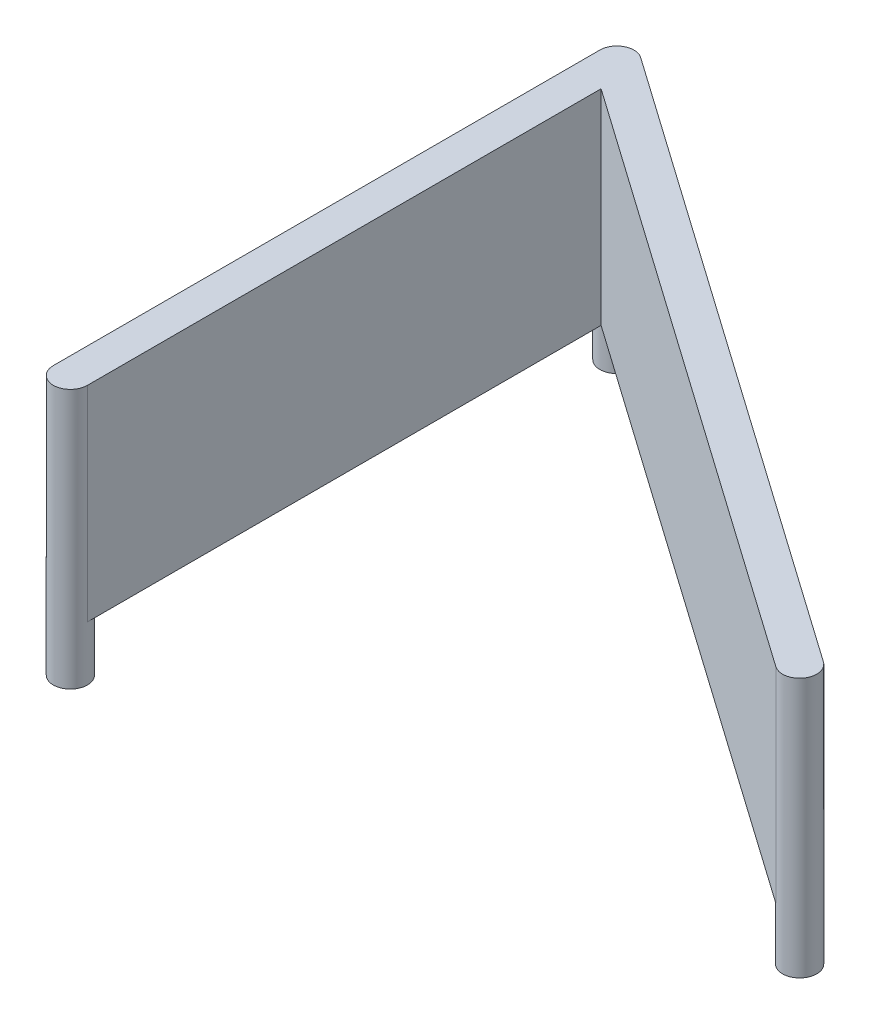
ISO-10303-21;
HEADER;
FILE_DESCRIPTION(('STEP AP214'),'2;1');
FILE_NAME('part.step','',(''),(''),'','','');
FILE_SCHEMA(('AUTOMOTIVE_DESIGN { 1 0 10303 214 1 1 1 1 }'));
ENDSEC;
DATA;
#1=APPLICATION_CONTEXT('core data for automotive mechanical design processes');
#2=APPLICATION_PROTOCOL_DEFINITION('international standard','automotive_design',2000,#1);
#3=PRODUCT_CONTEXT('',#1,'mechanical');
#4=PRODUCT('Part','Part','',(#3));
#5=PRODUCT_RELATED_PRODUCT_CATEGORY('part','',(#4));
#6=PRODUCT_DEFINITION_FORMATION('','',#4);
#7=PRODUCT_DEFINITION_CONTEXT('part definition',#1,'design');
#8=PRODUCT_DEFINITION('design','',#6,#7);
#9=PRODUCT_DEFINITION_SHAPE('','',#8);
#10=(LENGTH_UNIT() NAMED_UNIT(*) SI_UNIT(.MILLI.,.METRE.));
#11=(NAMED_UNIT(*) PLANE_ANGLE_UNIT() SI_UNIT($,.RADIAN.));
#12=(NAMED_UNIT(*) SI_UNIT($,.STERADIAN.) SOLID_ANGLE_UNIT());
#13=UNCERTAINTY_MEASURE_WITH_UNIT(LENGTH_MEASURE(1.E-05),#10,'distance_accuracy_value','');
#14=(GEOMETRIC_REPRESENTATION_CONTEXT(3) GLOBAL_UNCERTAINTY_ASSIGNED_CONTEXT((#13)) GLOBAL_UNIT_ASSIGNED_CONTEXT((#10,
#11,#12)) REPRESENTATION_CONTEXT('',''));
#15=CARTESIAN_POINT('',(0.,0.,0.));
#16=DIRECTION('',(0.,0.,1.));
#17=DIRECTION('',(1.,0.,0.));
#18=AXIS2_PLACEMENT_3D('',#15,#16,#17);
#19=CARTESIAN_POINT('',(0.,0.,0.));
#20=DIRECTION('',(0.,1.,0.));
#21=DIRECTION('',(0.,0.,1.));
#22=AXIS2_PLACEMENT_3D('',#19,#20,#21);
#23=PLANE('',#22);
#24=CARTESIAN_POINT('',(114.3,0.,-21.2781474317232));
#25=DIRECTION('',(0.,1.,0.));
#26=DIRECTION('',(0.,0.,1.));
#27=AXIS2_PLACEMENT_3D('',#24,#25,#26);
#28=CIRCLE('',#27,3.17500000000001);
#29=CARTESIAN_POINT('',(112.474503350721,0.,-18.6804201589959));
#30=VERTEX_POINT('',#29);
#31=CARTESIAN_POINT('',(116.125496649279,0.,-23.8758747044505));
#32=VERTEX_POINT('',#31);
#33=EDGE_CURVE('E11',#30,#32,#28,.F.);
#34=ORIENTED_EDGE('',*,*,#33,.F.);
#35=DIRECTION('',(0.818181818181818,0.,0.574959574576069));
#36=VECTOR('',#35,1.);
#37=CARTESIAN_POINT('',(3.175,0.,-95.4882818731034));
#38=LINE('',#37,#36);
#39=CARTESIAN_POINT('',(3.175,0.,-95.4882818731034));
#40=VERTEX_POINT('',#39);
#41=EDGE_CURVE('E135',#40,#30,#38,.T.);
#42=ORIENTED_EDGE('',*,*,#41,.F.);
#43=DIRECTION('',(0.,0.,-1.));
#44=VECTOR('',#43,1.);
#45=CARTESIAN_POINT('',(3.175,0.,0.));
#46=LINE('',#45,#44);
#47=CARTESIAN_POINT('',(3.175,0.,0.));
#48=VERTEX_POINT('',#47);
#49=EDGE_CURVE('E132',#48,#40,#46,.T.);
#50=ORIENTED_EDGE('',*,*,#49,.F.);
#51=CARTESIAN_POINT('',(0.,0.,0.));
#52=DIRECTION('',(0.,-1.,0.));
#53=DIRECTION('',(0.,0.,-1.));
#54=AXIS2_PLACEMENT_3D('',#51,#52,#53);
#55=CIRCLE('',#54,3.175);
#56=CARTESIAN_POINT('',(-3.175,0.,0.));
#57=VERTEX_POINT('',#56);
#58=EDGE_CURVE('E49',#57,#48,#55,.T.);
#59=ORIENTED_EDGE('',*,*,#58,.F.);
#60=DIRECTION('',(0.,0.,1.));
#61=VECTOR('',#60,1.);
#62=CARTESIAN_POINT('',(-3.175,0.,0.));
#63=LINE('',#62,#61);
#64=CARTESIAN_POINT('',(-3.175,0.,-101.6));
#65=VERTEX_POINT('',#64);
#66=EDGE_CURVE('E142',#65,#57,#63,.T.);
#67=ORIENTED_EDGE('',*,*,#66,.F.);
#68=CARTESIAN_POINT('',(0.,0.,-101.6));
#69=DIRECTION('',(0.,-1.,0.));
#70=DIRECTION('',(0.,0.,-1.));
#71=AXIS2_PLACEMENT_3D('',#68,#69,#70);
#72=CIRCLE('',#71,3.175);
#73=CARTESIAN_POINT('',(1.82549664927902,0.,-104.197727272727));
#74=VERTEX_POINT('',#73);
#75=EDGE_CURVE('E74',#74,#65,#72,.T.);
#76=ORIENTED_EDGE('',*,*,#75,.F.);
#77=DIRECTION('',(-0.818181818181818,0.,-0.574959574576069));
#78=VECTOR('',#77,1.);
#79=CARTESIAN_POINT('',(1.82549664927902,0.,-104.197727272727));
#80=LINE('',#79,#78);
#81=EDGE_CURVE('E116',#32,#74,#80,.T.);
#82=ORIENTED_EDGE('',*,*,#81,.F.);
#83=EDGE_LOOP('',(#34,#42,#50,#59,#67,#76,#82));
#84=FACE_BOUND('',#83,.T.);
#85=ADVANCED_FACE('F39',(#84),#23,.F.);
#86=CARTESIAN_POINT('',(0.,38.1,0.));
#87=DIRECTION('',(0.,-1.,0.));
#88=DIRECTION('',(0.,0.,-1.));
#89=AXIS2_PLACEMENT_3D('',#86,#87,#88);
#90=CYLINDRICAL_SURFACE('',#89,3.175);
#91=DIRECTION('',(0.,-1.,0.));
#92=VECTOR('',#91,1.);
#93=CARTESIAN_POINT('',(-3.175,38.1,0.));
#94=LINE('',#93,#92);
#95=CARTESIAN_POINT('',(-3.175,38.1,0.));
#96=VERTEX_POINT('',#95);
#97=EDGE_CURVE('E128',#96,#57,#94,.T.);
#98=ORIENTED_EDGE('',*,*,#97,.T.);
#99=ORIENTED_EDGE('',*,*,#58,.T.);
#100=DIRECTION('',(0.,-1.,0.));
#101=VECTOR('',#100,1.);
#102=CARTESIAN_POINT('',(3.175,38.1,0.));
#103=LINE('',#102,#101);
#104=CARTESIAN_POINT('',(3.175,38.1,0.));
#105=VERTEX_POINT('',#104);
#106=EDGE_CURVE('E160',#105,#48,#103,.T.);
#107=ORIENTED_EDGE('',*,*,#106,.F.);
#108=CARTESIAN_POINT('',(0.,38.1,0.));
#109=DIRECTION('',(0.,1.,0.));
#110=DIRECTION('',(0.,0.,1.));
#111=AXIS2_PLACEMENT_3D('',#108,#109,#110);
#112=CIRCLE('',#111,3.175);
#113=EDGE_CURVE('E145',#96,#105,#112,.T.);
#114=ORIENTED_EDGE('',*,*,#113,.F.);
#115=EDGE_LOOP('',(#98,#99,#107,#114));
#116=FACE_BOUND('',#115,.T.);
#117=CARTESIAN_POINT('',(0.,-10.16,0.));
#118=DIRECTION('',(0.,-1.,0.));
#119=DIRECTION('',(0.,0.,-1.));
#120=AXIS2_PLACEMENT_3D('',#117,#118,#119);
#121=CIRCLE('',#120,3.175);
#122=CARTESIAN_POINT('',(0.,-10.16,-3.175));
#123=VERTEX_POINT('',#122);
#124=EDGE_CURVE('E136',#123,#123,#121,.T.);
#125=ORIENTED_EDGE('',*,*,#124,.F.);
#126=EDGE_LOOP('',(#125));
#127=FACE_BOUND('',#126,.T.);
#128=ADVANCED_FACE('F41',(#116,#127),#90,.T.);
#129=CARTESIAN_POINT('',(3.175,38.1,0.));
#130=DIRECTION('',(-1.,0.,0.));
#131=DIRECTION('',(0.,0.,1.));
#132=AXIS2_PLACEMENT_3D('',#129,#130,#131);
#133=PLANE('',#132);
#134=ORIENTED_EDGE('',*,*,#49,.T.);
#135=DIRECTION('',(0.,-1.,0.));
#136=VECTOR('',#135,1.);
#137=CARTESIAN_POINT('',(3.175,38.1,-95.4882818731034));
#138=LINE('',#137,#136);
#139=CARTESIAN_POINT('',(3.175,38.1,-95.4882818731034));
#140=VERTEX_POINT('',#139);
#141=EDGE_CURVE('E157',#140,#40,#138,.T.);
#142=ORIENTED_EDGE('',*,*,#141,.F.);
#143=DIRECTION('',(0.,0.,-1.));
#144=VECTOR('',#143,1.);
#145=CARTESIAN_POINT('',(3.175,38.1,0.));
#146=LINE('',#145,#144);
#147=EDGE_CURVE('E88',#105,#140,#146,.T.);
#148=ORIENTED_EDGE('',*,*,#147,.F.);
#149=ORIENTED_EDGE('',*,*,#106,.T.);
#150=EDGE_LOOP('',(#134,#142,#148,#149));
#151=FACE_BOUND('',#150,.T.);
#152=ADVANCED_FACE('F201',(#151),#133,.F.);
#153=CARTESIAN_POINT('',(3.175,38.1,-95.4882818731034));
#154=DIRECTION('',(0.574959574576069,0.,-0.818181818181818));
#155=DIRECTION('',(-0.818181818181818,0.,-0.574959574576069));
#156=AXIS2_PLACEMENT_3D('',#153,#154,#155);
#157=PLANE('',#156);
#158=ORIENTED_EDGE('',*,*,#41,.T.);
#159=DIRECTION('',(0.,-1.,0.));
#160=VECTOR('',#159,1.);
#161=CARTESIAN_POINT('',(112.474503350721,38.1,-18.6804201589959));
#162=LINE('',#161,#160);
#163=CARTESIAN_POINT('',(112.474503350721,38.1,-18.6804201589959));
#164=VERTEX_POINT('',#163);
#165=EDGE_CURVE('E153',#164,#30,#162,.T.);
#166=ORIENTED_EDGE('',*,*,#165,.F.);
#167=DIRECTION('',(0.818181818181818,0.,0.574959574576069));
#168=VECTOR('',#167,1.);
#169=CARTESIAN_POINT('',(3.175,38.1,-95.4882818731034));
#170=LINE('',#169,#168);
#171=EDGE_CURVE('E173',#140,#164,#170,.T.);
#172=ORIENTED_EDGE('',*,*,#171,.F.);
#173=ORIENTED_EDGE('',*,*,#141,.T.);
#174=EDGE_LOOP('',(#158,#166,#172,#173));
#175=FACE_BOUND('',#174,.T.);
#176=ADVANCED_FACE('F193',(#175),#157,.F.);
#177=CARTESIAN_POINT('',(114.3,38.1,-21.2781474317232));
#178=DIRECTION('',(0.,-1.,0.));
#179=DIRECTION('',(0.,0.,-1.));
#180=AXIS2_PLACEMENT_3D('',#177,#178,#179);
#181=CYLINDRICAL_SURFACE('',#180,3.17500000000001);
#182=ORIENTED_EDGE('',*,*,#165,.T.);
#183=ORIENTED_EDGE('',*,*,#33,.T.);
#184=DIRECTION('',(0.,-1.,0.));
#185=VECTOR('',#184,1.);
#186=CARTESIAN_POINT('',(116.125496649279,38.1,-23.8758747044505));
#187=LINE('',#186,#185);
#188=CARTESIAN_POINT('',(116.125496649279,38.1,-23.8758747044505));
#189=VERTEX_POINT('',#188);
#190=EDGE_CURVE('E119',#189,#32,#187,.T.);
#191=ORIENTED_EDGE('',*,*,#190,.F.);
#192=CARTESIAN_POINT('',(114.3,38.1,-21.2781474317232));
#193=DIRECTION('',(0.,1.,0.));
#194=DIRECTION('',(0.,0.,1.));
#195=AXIS2_PLACEMENT_3D('',#192,#193,#194);
#196=CIRCLE('',#195,3.17500000000001);
#197=EDGE_CURVE('E107',#164,#189,#196,.T.);
#198=ORIENTED_EDGE('',*,*,#197,.F.);
#199=EDGE_LOOP('',(#182,#183,#191,#198));
#200=FACE_BOUND('',#199,.T.);
#201=CARTESIAN_POINT('',(114.3,-10.16,-21.2781474317232));
#202=DIRECTION('',(0.,-1.,0.));
#203=DIRECTION('',(0.,0.,-1.));
#204=AXIS2_PLACEMENT_3D('',#201,#202,#203);
#205=CIRCLE('',#204,3.17500000000001);
#206=CARTESIAN_POINT('',(114.3,-10.16,-24.4531474317232));
#207=VERTEX_POINT('',#206);
#208=EDGE_CURVE('E184',#207,#207,#205,.T.);
#209=ORIENTED_EDGE('',*,*,#208,.F.);
#210=EDGE_LOOP('',(#209));
#211=FACE_BOUND('',#210,.T.);
#212=ADVANCED_FACE('F191',(#200,#211),#181,.T.);
#213=CARTESIAN_POINT('',(1.82549664927902,38.1,-104.197727272727));
#214=DIRECTION('',(-0.574959574576069,0.,0.818181818181818));
#215=DIRECTION('',(0.818181818181818,0.,0.574959574576069));
#216=AXIS2_PLACEMENT_3D('',#213,#214,#215);
#217=PLANE('',#216);
#218=ORIENTED_EDGE('',*,*,#81,.T.);
#219=DIRECTION('',(0.,-1.,0.));
#220=VECTOR('',#219,1.);
#221=CARTESIAN_POINT('',(1.82549664927902,38.1,-104.197727272727));
#222=LINE('',#221,#220);
#223=CARTESIAN_POINT('',(1.82549664927902,38.1,-104.197727272727));
#224=VERTEX_POINT('',#223);
#225=EDGE_CURVE('E114',#224,#74,#222,.T.);
#226=ORIENTED_EDGE('',*,*,#225,.F.);
#227=DIRECTION('',(-0.818181818181818,0.,-0.574959574576069));
#228=VECTOR('',#227,1.);
#229=CARTESIAN_POINT('',(1.82549664927902,38.1,-104.197727272727));
#230=LINE('',#229,#228);
#231=EDGE_CURVE('E100',#189,#224,#230,.T.);
#232=ORIENTED_EDGE('',*,*,#231,.F.);
#233=ORIENTED_EDGE('',*,*,#190,.T.);
#234=EDGE_LOOP('',(#218,#226,#232,#233));
#235=FACE_BOUND('',#234,.T.);
#236=ADVANCED_FACE('F115',(#235),#217,.F.);
#237=CARTESIAN_POINT('',(0.,38.1,-101.6));
#238=DIRECTION('',(0.,-1.,0.));
#239=DIRECTION('',(0.,0.,-1.));
#240=AXIS2_PLACEMENT_3D('',#237,#238,#239);
#241=CYLINDRICAL_SURFACE('',#240,3.175);
#242=ORIENTED_EDGE('',*,*,#225,.T.);
#243=ORIENTED_EDGE('',*,*,#75,.T.);
#244=DIRECTION('',(0.,-1.,0.));
#245=VECTOR('',#244,1.);
#246=CARTESIAN_POINT('',(-3.175,38.1,-101.6));
#247=LINE('',#246,#245);
#248=CARTESIAN_POINT('',(-3.175,38.1,-101.6));
#249=VERTEX_POINT('',#248);
#250=EDGE_CURVE('E120',#249,#65,#247,.T.);
#251=ORIENTED_EDGE('',*,*,#250,.F.);
#252=CARTESIAN_POINT('',(0.,38.1,-101.6));
#253=DIRECTION('',(0.,1.,0.));
#254=DIRECTION('',(0.,0.,1.));
#255=AXIS2_PLACEMENT_3D('',#252,#253,#254);
#256=CIRCLE('',#255,3.175);
#257=EDGE_CURVE('E104',#224,#249,#256,.T.);
#258=ORIENTED_EDGE('',*,*,#257,.F.);
#259=EDGE_LOOP('',(#242,#243,#251,#258));
#260=FACE_BOUND('',#259,.T.);
#261=CARTESIAN_POINT('',(0.,-10.16,-101.6));
#262=DIRECTION('',(0.,-1.,0.));
#263=DIRECTION('',(0.,0.,-1.));
#264=AXIS2_PLACEMENT_3D('',#261,#262,#263);
#265=CIRCLE('',#264,3.175);
#266=CARTESIAN_POINT('',(0.,-10.16,-104.775));
#267=VERTEX_POINT('',#266);
#268=EDGE_CURVE('E179',#267,#267,#265,.T.);
#269=ORIENTED_EDGE('',*,*,#268,.F.);
#270=EDGE_LOOP('',(#269));
#271=FACE_BOUND('',#270,.T.);
#272=ADVANCED_FACE('F122',(#260,#271),#241,.T.);
#273=CARTESIAN_POINT('',(-3.175,38.1,0.));
#274=DIRECTION('',(1.,0.,0.));
#275=DIRECTION('',(0.,0.,-1.));
#276=AXIS2_PLACEMENT_3D('',#273,#274,#275);
#277=PLANE('',#276);
#278=ORIENTED_EDGE('',*,*,#66,.T.);
#279=ORIENTED_EDGE('',*,*,#97,.F.);
#280=DIRECTION('',(0.,0.,1.));
#281=VECTOR('',#280,1.);
#282=CARTESIAN_POINT('',(-3.175,38.1,0.));
#283=LINE('',#282,#281);
#284=EDGE_CURVE('E57',#249,#96,#283,.T.);
#285=ORIENTED_EDGE('',*,*,#284,.F.);
#286=ORIENTED_EDGE('',*,*,#250,.T.);
#287=EDGE_LOOP('',(#278,#279,#285,#286));
#288=FACE_BOUND('',#287,.T.);
#289=ADVANCED_FACE('F213',(#288),#277,.F.);
#290=CARTESIAN_POINT('',(0.,38.1,0.));
#291=DIRECTION('',(0.,1.,0.));
#292=DIRECTION('',(0.,0.,1.));
#293=AXIS2_PLACEMENT_3D('',#290,#291,#292);
#294=PLANE('',#293);
#295=ORIENTED_EDGE('',*,*,#113,.T.);
#296=ORIENTED_EDGE('',*,*,#147,.T.);
#297=ORIENTED_EDGE('',*,*,#171,.T.);
#298=ORIENTED_EDGE('',*,*,#197,.T.);
#299=ORIENTED_EDGE('',*,*,#231,.T.);
#300=ORIENTED_EDGE('',*,*,#257,.T.);
#301=ORIENTED_EDGE('',*,*,#284,.T.);
#302=EDGE_LOOP('',(#295,#296,#297,#298,#299,#300,#301));
#303=FACE_BOUND('',#302,.T.);
#304=ADVANCED_FACE('F102',(#303),#294,.T.);
#305=CARTESIAN_POINT('',(0.,-10.16,0.));
#306=DIRECTION('',(0.,-1.,0.));
#307=DIRECTION('',(0.,0.,-1.));
#308=AXIS2_PLACEMENT_3D('',#305,#306,#307);
#309=PLANE('',#308);
#310=ORIENTED_EDGE('',*,*,#124,.T.);
#311=EDGE_LOOP('',(#310));
#312=FACE_BOUND('',#311,.T.);
#313=ADVANCED_FACE('F233',(#312),#309,.T.);
#314=CARTESIAN_POINT('',(0.,-10.16,-101.6));
#315=DIRECTION('',(0.,-1.,0.));
#316=DIRECTION('',(0.,0.,-1.));
#317=AXIS2_PLACEMENT_3D('',#314,#315,#316);
#318=PLANE('',#317);
#319=ORIENTED_EDGE('',*,*,#268,.T.);
#320=EDGE_LOOP('',(#319));
#321=FACE_BOUND('',#320,.T.);
#322=ADVANCED_FACE('F239',(#321),#318,.T.);
#323=CARTESIAN_POINT('',(114.3,-10.16,-21.2781474317232));
#324=DIRECTION('',(0.,-1.,0.));
#325=DIRECTION('',(0.,0.,-1.));
#326=AXIS2_PLACEMENT_3D('',#323,#324,#325);
#327=PLANE('',#326);
#328=ORIENTED_EDGE('',*,*,#208,.T.);
#329=EDGE_LOOP('',(#328));
#330=FACE_BOUND('',#329,.T.);
#331=ADVANCED_FACE('F189',(#330),#327,.T.);
#332=CLOSED_SHELL('',(#85,#128,#152,#176,#212,#236,#272,#289,#304,#313,#322,#331));
#333=MANIFOLD_SOLID_BREP('B2',#332);
#334=ADVANCED_BREP_SHAPE_REPRESENTATION('',(#18,#333),#14);
#335=SHAPE_DEFINITION_REPRESENTATION(#9,#334);
ENDSEC;
END-ISO-10303-21;
